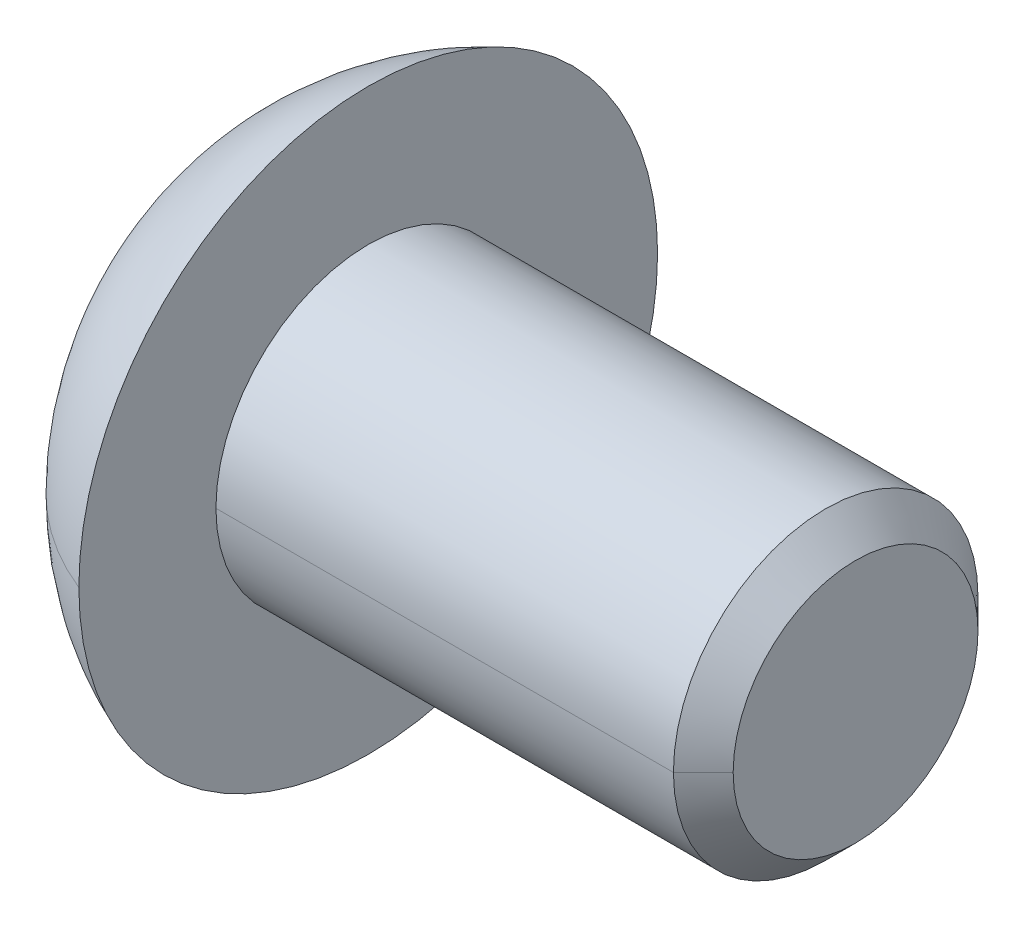
ISO-10303-21;
HEADER;
FILE_DESCRIPTION(('STEP AP214'),'2;1');
FILE_NAME('part.step','',(''),(''),'','','');
FILE_SCHEMA(('AUTOMOTIVE_DESIGN { 1 0 10303 214 1 1 1 1 }'));
ENDSEC;
DATA;
#1=APPLICATION_CONTEXT('core data for automotive mechanical design processes');
#2=APPLICATION_PROTOCOL_DEFINITION('international standard','automotive_design',2000,#1);
#3=PRODUCT_CONTEXT('',#1,'mechanical');
#4=PRODUCT('Part','Part','',(#3));
#5=PRODUCT_RELATED_PRODUCT_CATEGORY('part','',(#4));
#6=PRODUCT_DEFINITION_FORMATION('','',#4);
#7=PRODUCT_DEFINITION_CONTEXT('part definition',#1,'design');
#8=PRODUCT_DEFINITION('design','',#6,#7);
#9=PRODUCT_DEFINITION_SHAPE('','',#8);
#10=(LENGTH_UNIT() NAMED_UNIT(*) SI_UNIT(.MILLI.,.METRE.));
#11=(NAMED_UNIT(*) PLANE_ANGLE_UNIT() SI_UNIT($,.RADIAN.));
#12=(NAMED_UNIT(*) SI_UNIT($,.STERADIAN.) SOLID_ANGLE_UNIT());
#13=UNCERTAINTY_MEASURE_WITH_UNIT(LENGTH_MEASURE(1.E-05),#10,'distance_accuracy_value','');
#14=(GEOMETRIC_REPRESENTATION_CONTEXT(3) GLOBAL_UNCERTAINTY_ASSIGNED_CONTEXT((#13)) GLOBAL_UNIT_ASSIGNED_CONTEXT((#10,
#11,#12)) REPRESENTATION_CONTEXT('',''));
#15=CARTESIAN_POINT('',(0.,0.,0.));
#16=DIRECTION('',(0.,0.,1.));
#17=DIRECTION('',(1.,0.,0.));
#18=AXIS2_PLACEMENT_3D('',#15,#16,#17);
#19=CARTESIAN_POINT('',(-1.19,0.,0.));
#20=DIRECTION('',(1.,0.,0.));
#21=DIRECTION('',(0.,0.,-1.));
#22=AXIS2_PLACEMENT_3D('',#19,#20,#21);
#23=PLANE('',#22);
#24=DIRECTION('',(0.,-1.,0.));
#25=VECTOR('',#24,1.);
#26=CARTESIAN_POINT('',(-1.19,0.86602540378444,1.5));
#27=LINE('',#26,#25);
#28=CARTESIAN_POINT('',(-1.19,0.86602540378444,1.5));
#29=VERTEX_POINT('',#28);
#30=CARTESIAN_POINT('',(-1.19,0.,1.5));
#31=VERTEX_POINT('',#30);
#32=EDGE_CURVE('E11',#29,#31,#27,.T.);
#33=ORIENTED_EDGE('',*,*,#32,.F.);
#34=DIRECTION('',(0.,-0.500000000000009,0.866025403784433));
#35=VECTOR('',#34,1.);
#36=CARTESIAN_POINT('',(-1.19,1.7320508075689,0.));
#37=LINE('',#36,#35);
#38=CARTESIAN_POINT('',(-1.19,1.29903810567666,0.750000000000019));
#39=VERTEX_POINT('',#38);
#40=EDGE_CURVE('E25',#39,#29,#37,.T.);
#41=ORIENTED_EDGE('',*,*,#40,.F.);
#42=CARTESIAN_POINT('',(-1.19,0.,0.));
#43=DIRECTION('',(1.,0.,0.));
#44=DIRECTION('',(0.,0.,-1.));
#45=AXIS2_PLACEMENT_3D('',#42,#43,#44);
#46=CIRCLE('',#45,1.5);
#47=EDGE_CURVE('E392',#39,#31,#46,.T.);
#48=ORIENTED_EDGE('',*,*,#47,.T.);
#49=EDGE_LOOP('',(#33,#41,#48));
#50=FACE_BOUND('',#49,.T.);
#51=ADVANCED_FACE('F17',(#50),#23,.F.);
#52=CARTESIAN_POINT('',(-500.323974596216,0.,0.));
#53=DIRECTION('',(-1.,0.,0.));
#54=DIRECTION('',(0.,-1.,0.));
#55=AXIS2_PLACEMENT_3D('',#52,#53,#54);
#56=CONICAL_SURFACE('',#55,866.0254037844,1.0471975512);
#57=DIRECTION('',(-0.499999999997039,0.,0.866025403786148));
#58=VECTOR('',#57,1.);
#59=CARTESIAN_POINT('',(-0.323974600166881,0.,0.));
#60=LINE('',#59,#58);
#61=CARTESIAN_POINT('',(-0.32397459621556,0.,0.));
#62=VERTEX_POINT('',#61);
#63=EDGE_CURVE('E387',#62,#31,#60,.T.);
#64=ORIENTED_EDGE('',*,*,#63,.T.);
#65=ORIENTED_EDGE('',*,*,#47,.F.);
#66=CARTESIAN_POINT('',(-1.19,0.,0.));
#67=DIRECTION('',(1.,0.,0.));
#68=DIRECTION('',(0.,0.,-1.));
#69=AXIS2_PLACEMENT_3D('',#66,#67,#68);
#70=CIRCLE('',#69,1.5);
#71=CARTESIAN_POINT('',(-1.19,1.29903810567666,-0.750000000000019));
#72=VERTEX_POINT('',#71);
#73=EDGE_CURVE('E382',#72,#39,#70,.T.);
#74=ORIENTED_EDGE('',*,*,#73,.F.);
#75=CARTESIAN_POINT('',(-1.19,0.,0.));
#76=DIRECTION('',(1.,0.,0.));
#77=DIRECTION('',(0.,0.,-1.));
#78=AXIS2_PLACEMENT_3D('',#75,#76,#77);
#79=CIRCLE('',#78,1.5);
#80=CARTESIAN_POINT('',(-1.19,0.,-1.5));
#81=VERTEX_POINT('',#80);
#82=EDGE_CURVE('E377',#81,#72,#79,.T.);
#83=ORIENTED_EDGE('',*,*,#82,.F.);
#84=DIRECTION('',(-0.499999999997039,0.,-0.866025403786148));
#85=VECTOR('',#84,1.);
#86=CARTESIAN_POINT('',(-0.323974600166881,0.,0.));
#87=LINE('',#86,#85);
#88=EDGE_CURVE('E372',#62,#81,#87,.T.);
#89=ORIENTED_EDGE('',*,*,#88,.F.);
#90=EDGE_LOOP('',(#64,#65,#74,#83,#89));
#91=FACE_BOUND('',#90,.T.);
#92=ADVANCED_FACE('F408',(#91),#56,.F.);
#93=CARTESIAN_POINT('',(-500.323974596216,0.,0.));
#94=DIRECTION('',(-1.,0.,0.));
#95=DIRECTION('',(0.,1.,0.));
#96=AXIS2_PLACEMENT_3D('',#93,#94,#95);
#97=CONICAL_SURFACE('',#96,866.0254037844,1.0471975512);
#98=ORIENTED_EDGE('',*,*,#88,.T.);
#99=CARTESIAN_POINT('',(-1.19,0.,0.));
#100=DIRECTION('',(1.,0.,0.));
#101=DIRECTION('',(0.,0.,-1.));
#102=AXIS2_PLACEMENT_3D('',#99,#100,#101);
#103=CIRCLE('',#102,1.5);
#104=CARTESIAN_POINT('',(-1.19,-1.29903810567666,-0.750000000000019));
#105=VERTEX_POINT('',#104);
#106=EDGE_CURVE('E367',#105,#81,#103,.T.);
#107=ORIENTED_EDGE('',*,*,#106,.F.);
#108=CARTESIAN_POINT('',(-1.19,0.,0.));
#109=DIRECTION('',(1.,0.,0.));
#110=DIRECTION('',(0.,0.,-1.));
#111=AXIS2_PLACEMENT_3D('',#108,#109,#110);
#112=CIRCLE('',#111,1.5);
#113=CARTESIAN_POINT('',(-1.19,-1.29903810567666,0.750000000000019));
#114=VERTEX_POINT('',#113);
#115=EDGE_CURVE('E362',#114,#105,#112,.T.);
#116=ORIENTED_EDGE('',*,*,#115,.F.);
#117=CARTESIAN_POINT('',(-1.19,0.,0.));
#118=DIRECTION('',(1.,0.,0.));
#119=DIRECTION('',(0.,0.,-1.));
#120=AXIS2_PLACEMENT_3D('',#117,#118,#119);
#121=CIRCLE('',#120,1.5);
#122=EDGE_CURVE('E357',#31,#114,#121,.T.);
#123=ORIENTED_EDGE('',*,*,#122,.F.);
#124=ORIENTED_EDGE('',*,*,#63,.F.);
#125=EDGE_LOOP('',(#98,#107,#116,#123,#124));
#126=FACE_BOUND('',#125,.T.);
#127=ADVANCED_FACE('F423',(#126),#97,.F.);
#128=CARTESIAN_POINT('',(-1.19,0.,0.));
#129=DIRECTION('',(1.,0.,0.));
#130=DIRECTION('',(0.,0.,-1.));
#131=AXIS2_PLACEMENT_3D('',#128,#129,#130);
#132=PLANE('',#131);
#133=DIRECTION('',(0.,-0.500000000000009,-0.866025403784433));
#134=VECTOR('',#133,1.);
#135=CARTESIAN_POINT('',(-1.19,-0.86602540378444,1.5));
#136=LINE('',#135,#134);
#137=CARTESIAN_POINT('',(-1.19,-0.86602540378444,1.5));
#138=VERTEX_POINT('',#137);
#139=EDGE_CURVE('E352',#138,#114,#136,.T.);
#140=ORIENTED_EDGE('',*,*,#139,.F.);
#141=DIRECTION('',(0.,-1.,0.));
#142=VECTOR('',#141,1.);
#143=CARTESIAN_POINT('',(-1.19,0.86602540378444,1.5));
#144=LINE('',#143,#142);
#145=EDGE_CURVE('E347',#31,#138,#144,.T.);
#146=ORIENTED_EDGE('',*,*,#145,.F.);
#147=ORIENTED_EDGE('',*,*,#122,.T.);
#148=EDGE_LOOP('',(#140,#146,#147));
#149=FACE_BOUND('',#148,.T.);
#150=ADVANCED_FACE('F438',(#149),#132,.F.);
#151=CARTESIAN_POINT('',(-1.19,0.86602540378444,1.5));
#152=DIRECTION('',(0.,0.,-1.));
#153=DIRECTION('',(-1.,0.,0.));
#154=AXIS2_PLACEMENT_3D('',#151,#152,#153);
#155=PLANE('',#154);
#156=ORIENTED_EDGE('',*,*,#32,.T.);
#157=ORIENTED_EDGE('',*,*,#145,.T.);
#158=DIRECTION('',(-1.,0.,0.));
#159=VECTOR('',#158,1.);
#160=CARTESIAN_POINT('',(-1.19,-0.86602540378444,1.5));
#161=LINE('',#160,#159);
#162=CARTESIAN_POINT('',(-2.75,-0.86602540378444,1.5));
#163=VERTEX_POINT('',#162);
#164=EDGE_CURVE('E343',#138,#163,#161,.T.);
#165=ORIENTED_EDGE('',*,*,#164,.T.);
#166=DIRECTION('',(0.,1.,0.));
#167=VECTOR('',#166,1.);
#168=CARTESIAN_POINT('',(-2.75,1.5,1.5));
#169=LINE('',#168,#167);
#170=CARTESIAN_POINT('',(-2.75,0.86602540378444,1.5));
#171=VERTEX_POINT('',#170);
#172=EDGE_CURVE('E339',#163,#171,#169,.T.);
#173=ORIENTED_EDGE('',*,*,#172,.T.);
#174=DIRECTION('',(-1.,0.,0.));
#175=VECTOR('',#174,1.);
#176=CARTESIAN_POINT('',(-1.19,0.86602540378444,1.5));
#177=LINE('',#176,#175);
#178=EDGE_CURVE('E334',#29,#171,#177,.T.);
#179=ORIENTED_EDGE('',*,*,#178,.F.);
#180=EDGE_LOOP('',(#156,#157,#165,#173,#179));
#181=FACE_BOUND('',#180,.T.);
#182=ADVANCED_FACE('F440',(#181),#155,.T.);
#183=CARTESIAN_POINT('',(-1.19,1.7320508075689,0.));
#184=DIRECTION('',(0.,-0.866025403784433,-0.500000000000009));
#185=DIRECTION('',(0.,0.500000000000009,-0.866025403784433));
#186=AXIS2_PLACEMENT_3D('',#183,#184,#185);
#187=PLANE('',#186);
#188=DIRECTION('',(0.,-0.500000000000009,0.866025403784433));
#189=VECTOR('',#188,1.);
#190=CARTESIAN_POINT('',(-1.19,1.7320508075689,0.));
#191=LINE('',#190,#189);
#192=CARTESIAN_POINT('',(-1.19,1.7320508075689,0.));
#193=VERTEX_POINT('',#192);
#194=EDGE_CURVE('E329',#193,#39,#191,.T.);
#195=ORIENTED_EDGE('',*,*,#194,.T.);
#196=ORIENTED_EDGE('',*,*,#40,.T.);
#197=ORIENTED_EDGE('',*,*,#178,.T.);
#198=DIRECTION('',(0.,0.500000000000009,-0.866025403784433));
#199=VECTOR('',#198,1.);
#200=CARTESIAN_POINT('',(-2.75,1.67403810567667,0.100480947161682));
#201=LINE('',#200,#199);
#202=CARTESIAN_POINT('',(-2.75,1.7320508075689,0.));
#203=VERTEX_POINT('',#202);
#204=EDGE_CURVE('E325',#171,#203,#201,.T.);
#205=ORIENTED_EDGE('',*,*,#204,.T.);
#206=DIRECTION('',(-1.,0.,0.));
#207=VECTOR('',#206,1.);
#208=CARTESIAN_POINT('',(-1.19,1.7320508075689,0.));
#209=LINE('',#208,#207);
#210=EDGE_CURVE('E320',#193,#203,#209,.T.);
#211=ORIENTED_EDGE('',*,*,#210,.F.);
#212=EDGE_LOOP('',(#195,#196,#197,#205,#211));
#213=FACE_BOUND('',#212,.T.);
#214=ADVANCED_FACE('F401',(#213),#187,.T.);
#215=CARTESIAN_POINT('',(-1.19,0.86602540378444,-1.5));
#216=DIRECTION('',(0.,-0.866025403784433,0.500000000000009));
#217=DIRECTION('',(0.,-0.500000000000009,-0.866025403784433));
#218=AXIS2_PLACEMENT_3D('',#215,#216,#217);
#219=PLANE('',#218);
#220=DIRECTION('',(0.,0.500000000000009,0.866025403784433));
#221=VECTOR('',#220,1.);
#222=CARTESIAN_POINT('',(-1.19,0.86602540378444,-1.5));
#223=LINE('',#222,#221);
#224=CARTESIAN_POINT('',(-1.19,0.86602540378444,-1.5));
#225=VERTEX_POINT('',#224);
#226=EDGE_CURVE('E315',#225,#72,#223,.T.);
#227=ORIENTED_EDGE('',*,*,#226,.T.);
#228=DIRECTION('',(0.,0.500000000000009,0.866025403784433));
#229=VECTOR('',#228,1.);
#230=CARTESIAN_POINT('',(-1.19,0.86602540378444,-1.5));
#231=LINE('',#230,#229);
#232=EDGE_CURVE('E310',#72,#193,#231,.T.);
#233=ORIENTED_EDGE('',*,*,#232,.T.);
#234=ORIENTED_EDGE('',*,*,#210,.T.);
#235=DIRECTION('',(0.,-0.500000000000009,-0.866025403784433));
#236=VECTOR('',#235,1.);
#237=CARTESIAN_POINT('',(-2.75,1.67403810567667,-0.100480947161682));
#238=LINE('',#237,#236);
#239=CARTESIAN_POINT('',(-2.75,0.86602540378444,-1.5));
#240=VERTEX_POINT('',#239);
#241=EDGE_CURVE('E306',#203,#240,#238,.T.);
#242=ORIENTED_EDGE('',*,*,#241,.T.);
#243=DIRECTION('',(-1.,0.,0.));
#244=VECTOR('',#243,1.);
#245=CARTESIAN_POINT('',(-1.19,0.86602540378444,-1.5));
#246=LINE('',#245,#244);
#247=EDGE_CURVE('E301',#225,#240,#246,.T.);
#248=ORIENTED_EDGE('',*,*,#247,.F.);
#249=EDGE_LOOP('',(#227,#233,#234,#242,#248));
#250=FACE_BOUND('',#249,.T.);
#251=ADVANCED_FACE('F411',(#250),#219,.T.);
#252=CARTESIAN_POINT('',(-1.19,-0.86602540378444,-1.5));
#253=DIRECTION('',(0.,0.,1.));
#254=DIRECTION('',(1.,0.,0.));
#255=AXIS2_PLACEMENT_3D('',#252,#253,#254);
#256=PLANE('',#255);
#257=DIRECTION('',(0.,1.,0.));
#258=VECTOR('',#257,1.);
#259=CARTESIAN_POINT('',(-1.19,-0.86602540378444,-1.5));
#260=LINE('',#259,#258);
#261=CARTESIAN_POINT('',(-1.19,-0.86602540378444,-1.5));
#262=VERTEX_POINT('',#261);
#263=EDGE_CURVE('E296',#262,#81,#260,.T.);
#264=ORIENTED_EDGE('',*,*,#263,.T.);
#265=DIRECTION('',(0.,1.,0.));
#266=VECTOR('',#265,1.);
#267=CARTESIAN_POINT('',(-1.19,-0.86602540378444,-1.5));
#268=LINE('',#267,#266);
#269=EDGE_CURVE('E291',#81,#225,#268,.T.);
#270=ORIENTED_EDGE('',*,*,#269,.T.);
#271=ORIENTED_EDGE('',*,*,#247,.T.);
#272=DIRECTION('',(0.,-1.,0.));
#273=VECTOR('',#272,1.);
#274=CARTESIAN_POINT('',(-2.75,1.5,-1.5));
#275=LINE('',#274,#273);
#276=CARTESIAN_POINT('',(-2.75,-0.86602540378444,-1.5));
#277=VERTEX_POINT('',#276);
#278=EDGE_CURVE('E287',#240,#277,#275,.T.);
#279=ORIENTED_EDGE('',*,*,#278,.T.);
#280=DIRECTION('',(-1.,0.,0.));
#281=VECTOR('',#280,1.);
#282=CARTESIAN_POINT('',(-1.19,-0.86602540378444,-1.5));
#283=LINE('',#282,#281);
#284=EDGE_CURVE('E282',#262,#277,#283,.T.);
#285=ORIENTED_EDGE('',*,*,#284,.F.);
#286=EDGE_LOOP('',(#264,#270,#271,#279,#285));
#287=FACE_BOUND('',#286,.T.);
#288=ADVANCED_FACE('F416',(#287),#256,.T.);
#289=CARTESIAN_POINT('',(-1.19,-1.7320508075689,0.));
#290=DIRECTION('',(0.,0.866025403784433,0.500000000000009));
#291=DIRECTION('',(0.,-0.500000000000009,0.866025403784433));
#292=AXIS2_PLACEMENT_3D('',#289,#290,#291);
#293=PLANE('',#292);
#294=DIRECTION('',(0.,0.500000000000009,-0.866025403784433));
#295=VECTOR('',#294,1.);
#296=CARTESIAN_POINT('',(-1.19,-1.7320508075689,0.));
#297=LINE('',#296,#295);
#298=CARTESIAN_POINT('',(-1.19,-1.7320508075689,0.));
#299=VERTEX_POINT('',#298);
#300=EDGE_CURVE('E277',#299,#105,#297,.T.);
#301=ORIENTED_EDGE('',*,*,#300,.T.);
#302=DIRECTION('',(0.,0.500000000000009,-0.866025403784433));
#303=VECTOR('',#302,1.);
#304=CARTESIAN_POINT('',(-1.19,-1.7320508075689,0.));
#305=LINE('',#304,#303);
#306=EDGE_CURVE('E272',#105,#262,#305,.T.);
#307=ORIENTED_EDGE('',*,*,#306,.T.);
#308=ORIENTED_EDGE('',*,*,#284,.T.);
#309=DIRECTION('',(0.,-0.500000000000009,0.866025403784433));
#310=VECTOR('',#309,1.);
#311=CARTESIAN_POINT('',(-2.75,-0.924038105676645,-1.39951905283836));
#312=LINE('',#311,#310);
#313=CARTESIAN_POINT('',(-2.75,-1.7320508075689,0.));
#314=VERTEX_POINT('',#313);
#315=EDGE_CURVE('E268',#277,#314,#312,.T.);
#316=ORIENTED_EDGE('',*,*,#315,.T.);
#317=DIRECTION('',(-1.,0.,0.));
#318=VECTOR('',#317,1.);
#319=CARTESIAN_POINT('',(-1.19,-1.7320508075689,0.));
#320=LINE('',#319,#318);
#321=EDGE_CURVE('E263',#299,#314,#320,.T.);
#322=ORIENTED_EDGE('',*,*,#321,.F.);
#323=EDGE_LOOP('',(#301,#307,#308,#316,#322));
#324=FACE_BOUND('',#323,.T.);
#325=ADVANCED_FACE('F428',(#324),#293,.T.);
#326=CARTESIAN_POINT('',(-1.19,-0.86602540378444,1.5));
#327=DIRECTION('',(0.,0.866025403784433,-0.500000000000009));
#328=DIRECTION('',(0.,0.500000000000009,0.866025403784433));
#329=AXIS2_PLACEMENT_3D('',#326,#327,#328);
#330=PLANE('',#329);
#331=ORIENTED_EDGE('',*,*,#139,.T.);
#332=DIRECTION('',(0.,-0.500000000000009,-0.866025403784433));
#333=VECTOR('',#332,1.);
#334=CARTESIAN_POINT('',(-1.19,-0.86602540378444,1.5));
#335=LINE('',#334,#333);
#336=EDGE_CURVE('E258',#114,#299,#335,.T.);
#337=ORIENTED_EDGE('',*,*,#336,.T.);
#338=ORIENTED_EDGE('',*,*,#321,.T.);
#339=DIRECTION('',(0.,0.500000000000009,0.866025403784433));
#340=VECTOR('',#339,1.);
#341=CARTESIAN_POINT('',(-2.75,-0.924038105676645,1.39951905283836));
#342=LINE('',#341,#340);
#343=EDGE_CURVE('E253',#314,#163,#342,.T.);
#344=ORIENTED_EDGE('',*,*,#343,.T.);
#345=ORIENTED_EDGE('',*,*,#164,.F.);
#346=EDGE_LOOP('',(#331,#337,#338,#344,#345));
#347=FACE_BOUND('',#346,.T.);
#348=ADVANCED_FACE('F433',(#347),#330,.T.);
#349=CARTESIAN_POINT('',(-2.75,1.5,0.));
#350=DIRECTION('',(1.,0.,0.));
#351=DIRECTION('',(0.,0.,-1.));
#352=AXIS2_PLACEMENT_3D('',#349,#350,#351);
#353=PLANE('',#352);
#354=CARTESIAN_POINT('',(-2.75,0.,0.));
#355=DIRECTION('',(1.,0.,0.));
#356=DIRECTION('',(0.,0.,-1.));
#357=AXIS2_PLACEMENT_3D('',#354,#355,#356);
#358=CIRCLE('',#357,1.8);
#359=CARTESIAN_POINT('',(-2.75,0.,-1.8));
#360=VERTEX_POINT('',#359);
#361=CARTESIAN_POINT('',(-2.75,0.,1.8));
#362=VERTEX_POINT('',#361);
#363=EDGE_CURVE('E249',#360,#362,#358,.T.);
#364=ORIENTED_EDGE('',*,*,#363,.F.);
#365=CARTESIAN_POINT('',(-2.75,0.,0.));
#366=DIRECTION('',(1.,0.,0.));
#367=DIRECTION('',(0.,0.,-1.));
#368=AXIS2_PLACEMENT_3D('',#365,#366,#367);
#369=CIRCLE('',#368,1.8);
#370=EDGE_CURVE('E247',#362,#360,#369,.T.);
#371=ORIENTED_EDGE('',*,*,#370,.F.);
#372=EDGE_LOOP('',(#364,#371));
#373=FACE_BOUND('',#372,.T.);
#374=ORIENTED_EDGE('',*,*,#315,.F.);
#375=ORIENTED_EDGE('',*,*,#278,.F.);
#376=ORIENTED_EDGE('',*,*,#241,.F.);
#377=ORIENTED_EDGE('',*,*,#204,.F.);
#378=ORIENTED_EDGE('',*,*,#172,.F.);
#379=ORIENTED_EDGE('',*,*,#343,.F.);
#380=EDGE_LOOP('',(#374,#375,#376,#377,#378,#379));
#381=FACE_BOUND('',#380,.T.);
#382=ADVANCED_FACE('F444',(#373,#381),#353,.F.);
#383=CARTESIAN_POINT('',(0.,0.,4.75));
#384=CARTESIAN_POINT('',(0.,-9.5,4.75));
#385=CARTESIAN_POINT('',(0.,-9.5,-4.75));
#386=CARTESIAN_POINT('',(0.,0.,-4.75));
#387=CARTESIAN_POINT('',(-1.33136495449777,0.,4.21509314825926));
#388=CARTESIAN_POINT('',(-1.33136495449777,-8.43018629651852,4.21509314825926));
#389=CARTESIAN_POINT('',(-1.33136495449777,-8.43018629651852,-4.21509314825926));
#390=CARTESIAN_POINT('',(-1.33136495449777,0.,-4.21509314825926));
#391=CARTESIAN_POINT('',(-2.30972286373403,0.,3.16558193653309));
#392=CARTESIAN_POINT('',(-2.30972286373403,-6.33116387306619,3.1655819365331));
#393=CARTESIAN_POINT('',(-2.30972286373403,-6.33116387306619,-3.1655819365331));
#394=CARTESIAN_POINT('',(-2.30972286373403,0.,-3.16558193653309));
#395=CARTESIAN_POINT('',(-2.75,0.,1.8));
#396=CARTESIAN_POINT('',(-2.75,-3.59999999999999,1.8));
#397=CARTESIAN_POINT('',(-2.75,-3.59999999999999,-1.8));
#398=CARTESIAN_POINT('',(-2.75,0.,-1.8));
#399=(BOUNDED_SURFACE() B_SPLINE_SURFACE(3,3,((#383,#384,#385,#386),(#387,#388,#389,#390),(#391,
#392,#393,#394),(#395,#396,#397,#398)),.UNSPECIFIED.,.F.,.F.,
.F.) B_SPLINE_SURFACE_WITH_KNOTS((4,4),(4,4),(0.,7.41739745553081),(-35.5435450504011,
-16.5500534312026),
.UNSPECIFIED.) GEOMETRIC_REPRESENTATION_ITEM() RATIONAL_B_SPLINE_SURFACE(((1.,0.333333333333333,
0.333333333333333,1.),(0.936944095829158,0.312314698609719,0.312314698609719,0.936944095829158),
(0.936944095829158,0.312314698609719,0.312314698609719,0.936944095829158),(1.,0.333333333333333,
0.333333333333333,1.))) REPRESENTATION_ITEM('') SURFACE());
#400=CARTESIAN_POINT('',(0.,0.,-4.75));
#401=CARTESIAN_POINT('',(-1.33136495449777,0.,-4.21509314825926));
#402=CARTESIAN_POINT('',(-2.30972286373403,0.,-3.16558193653309));
#403=CARTESIAN_POINT('',(-2.75,0.,-1.8));
#404=(BOUNDED_CURVE() B_SPLINE_CURVE(3,(#400,#401,#402,#403),.UNSPECIFIED.,.F.,
.F.) B_SPLINE_CURVE_WITH_KNOTS((4,4),(0.,7.41739745553081),
.UNSPECIFIED.) CURVE() GEOMETRIC_REPRESENTATION_ITEM() RATIONAL_B_SPLINE_CURVE((1.,
0.936944095829158,0.936944095829158,1.)) REPRESENTATION_ITEM(''));
#405=CARTESIAN_POINT('',(0.,0.,-4.75));
#406=VERTEX_POINT('',#405);
#407=EDGE_CURVE('E215',#406,#360,#404,.T.);
#408=CARTESIAN_POINT('',(0.,0.,0.));
#409=DIRECTION('',(1.,0.,0.));
#410=DIRECTION('',(0.,0.,-1.));
#411=AXIS2_PLACEMENT_3D('',#408,#409,#410);
#412=CIRCLE('',#411,4.75);
#413=CARTESIAN_POINT('',(0.,0.,4.75));
#414=VERTEX_POINT('',#413);
#415=EDGE_CURVE('E233',#414,#406,#412,.T.);
#416=CARTESIAN_POINT('',(0.,0.,4.75));
#417=CARTESIAN_POINT('',(-1.33136495449777,0.,4.21509314825926));
#418=CARTESIAN_POINT('',(-2.30972286373403,0.,3.16558193653309));
#419=CARTESIAN_POINT('',(-2.75,0.,1.8));
#420=(BOUNDED_CURVE() B_SPLINE_CURVE(3,(#416,#417,#418,#419),.UNSPECIFIED.,.F.,
.F.) B_SPLINE_CURVE_WITH_KNOTS((4,4),(0.,7.41739745553081),
.UNSPECIFIED.) CURVE() GEOMETRIC_REPRESENTATION_ITEM() RATIONAL_B_SPLINE_CURVE((1.,
0.936944095829158,0.936944095829158,1.)) REPRESENTATION_ITEM(''));
#421=EDGE_CURVE('E218',#414,#362,#420,.T.);
#422=ORIENTED_EDGE('',*,*,#370,.T.);
#423=ORIENTED_EDGE('',*,*,#407,.F.);
#424=ORIENTED_EDGE('',*,*,#415,.F.);
#425=ORIENTED_EDGE('',*,*,#421,.T.);
#426=EDGE_LOOP('',(#422,#423,#424,#425));
#427=FACE_BOUND('',#426,.T.);
#428=ADVANCED_FACE('F190',(#427),#399,.T.);
#429=CARTESIAN_POINT('',(0.,0.,-4.75));
#430=CARTESIAN_POINT('',(0.,9.5,-4.75));
#431=CARTESIAN_POINT('',(0.,9.5,4.75));
#432=CARTESIAN_POINT('',(0.,0.,4.75));
#433=CARTESIAN_POINT('',(-1.33136495449777,0.,-4.21509314825926));
#434=CARTESIAN_POINT('',(-1.33136495449777,8.43018629651852,-4.21509314825926));
#435=CARTESIAN_POINT('',(-1.33136495449777,8.43018629651852,4.21509314825926));
#436=CARTESIAN_POINT('',(-1.33136495449777,0.,4.21509314825926));
#437=CARTESIAN_POINT('',(-2.30972286373403,0.,-3.16558193653309));
#438=CARTESIAN_POINT('',(-2.30972286373403,6.33116387306619,-3.1655819365331));
#439=CARTESIAN_POINT('',(-2.30972286373403,6.33116387306619,3.1655819365331));
#440=CARTESIAN_POINT('',(-2.30972286373403,0.,3.16558193653309));
#441=CARTESIAN_POINT('',(-2.75,0.,-1.8));
#442=CARTESIAN_POINT('',(-2.75,3.59999999999999,-1.8));
#443=CARTESIAN_POINT('',(-2.75,3.59999999999999,1.8));
#444=CARTESIAN_POINT('',(-2.75,0.,1.8));
#445=(BOUNDED_SURFACE() B_SPLINE_SURFACE(3,3,((#429,#430,#431,#432),(#433,#434,#435,#436),(#437,
#438,#439,#440),(#441,#442,#443,#444)),.UNSPECIFIED.,.F.,.F.,
.F.) B_SPLINE_SURFACE_WITH_KNOTS((4,4),(4,4),(0.,7.41739745553081),(-54.5370366695999,
-35.5435450504013),
.UNSPECIFIED.) GEOMETRIC_REPRESENTATION_ITEM() RATIONAL_B_SPLINE_SURFACE(((1.,0.333333333333333,
0.333333333333333,1.),(0.936944095829158,0.312314698609719,0.312314698609719,0.936944095829158),
(0.936944095829158,0.312314698609719,0.312314698609719,0.936944095829158),(1.,0.333333333333333,
0.333333333333333,1.))) REPRESENTATION_ITEM('') SURFACE());
#446=CARTESIAN_POINT('',(0.,0.,0.));
#447=DIRECTION('',(1.,0.,0.));
#448=DIRECTION('',(0.,0.,-1.));
#449=AXIS2_PLACEMENT_3D('',#446,#447,#448);
#450=CIRCLE('',#449,4.75);
#451=EDGE_CURVE('E168',#406,#414,#450,.T.);
#452=ORIENTED_EDGE('',*,*,#451,.F.);
#453=ORIENTED_EDGE('',*,*,#407,.T.);
#454=ORIENTED_EDGE('',*,*,#363,.T.);
#455=ORIENTED_EDGE('',*,*,#421,.F.);
#456=EDGE_LOOP('',(#452,#453,#454,#455));
#457=FACE_BOUND('',#456,.T.);
#458=ADVANCED_FACE('F177',(#457),#445,.T.);
#459=CARTESIAN_POINT('',(0.,4.75,0.));
#460=DIRECTION('',(-1.,0.,0.));
#461=DIRECTION('',(0.,0.,1.));
#462=AXIS2_PLACEMENT_3D('',#459,#460,#461);
#463=PLANE('',#462);
#464=CARTESIAN_POINT('',(0.,0.,0.));
#465=DIRECTION('',(1.,0.,0.));
#466=DIRECTION('',(0.,0.,-1.));
#467=AXIS2_PLACEMENT_3D('',#464,#465,#466);
#468=CIRCLE('',#467,2.5);
#469=CARTESIAN_POINT('',(0.,0.,-2.5));
#470=VERTEX_POINT('',#469);
#471=CARTESIAN_POINT('',(0.,0.,2.5));
#472=VERTEX_POINT('',#471);
#473=EDGE_CURVE('E163',#470,#472,#468,.T.);
#474=ORIENTED_EDGE('',*,*,#473,.F.);
#475=CARTESIAN_POINT('',(0.,0.,0.));
#476=DIRECTION('',(1.,0.,0.));
#477=DIRECTION('',(0.,0.,-1.));
#478=AXIS2_PLACEMENT_3D('',#475,#476,#477);
#479=CIRCLE('',#478,2.5);
#480=EDGE_CURVE('E158',#472,#470,#479,.T.);
#481=ORIENTED_EDGE('',*,*,#480,.F.);
#482=EDGE_LOOP('',(#474,#481));
#483=FACE_BOUND('',#482,.T.);
#484=ORIENTED_EDGE('',*,*,#451,.T.);
#485=ORIENTED_EDGE('',*,*,#415,.T.);
#486=EDGE_LOOP('',(#484,#485));
#487=FACE_BOUND('',#486,.T.);
#488=ADVANCED_FACE('F189',(#483,#487),#463,.F.);
#489=CARTESIAN_POINT('',(8.,0.,0.));
#490=DIRECTION('',(-1.,0.,0.));
#491=DIRECTION('',(0.,1.,0.));
#492=AXIS2_PLACEMENT_3D('',#489,#490,#491);
#493=CYLINDRICAL_SURFACE('',#492,2.5);
#494=ORIENTED_EDGE('',*,*,#480,.T.);
#495=DIRECTION('',(-1.,0.,0.));
#496=VECTOR('',#495,1.);
#497=CARTESIAN_POINT('',(7.5095,0.,-2.5));
#498=LINE('',#497,#496);
#499=CARTESIAN_POINT('',(7.5095,0.,-2.5));
#500=VERTEX_POINT('',#499);
#501=EDGE_CURVE('E153',#500,#470,#498,.T.);
#502=ORIENTED_EDGE('',*,*,#501,.F.);
#503=CARTESIAN_POINT('',(7.5095,0.,0.));
#504=DIRECTION('',(1.,0.,0.));
#505=DIRECTION('',(0.,0.,-1.));
#506=AXIS2_PLACEMENT_3D('',#503,#504,#505);
#507=CIRCLE('',#506,2.5);
#508=CARTESIAN_POINT('',(7.5095,0.,2.5));
#509=VERTEX_POINT('',#508);
#510=EDGE_CURVE('E149',#509,#500,#507,.T.);
#511=ORIENTED_EDGE('',*,*,#510,.F.);
#512=DIRECTION('',(-1.,0.,0.));
#513=VECTOR('',#512,1.);
#514=CARTESIAN_POINT('',(7.5095,0.,2.5));
#515=LINE('',#514,#513);
#516=EDGE_CURVE('E137',#509,#472,#515,.T.);
#517=ORIENTED_EDGE('',*,*,#516,.T.);
#518=EDGE_LOOP('',(#494,#502,#511,#517));
#519=FACE_BOUND('',#518,.T.);
#520=ADVANCED_FACE('F511',(#519),#493,.T.);
#521=CARTESIAN_POINT('',(8.,0.,0.));
#522=DIRECTION('',(-1.,0.,0.));
#523=DIRECTION('',(0.,-1.,0.));
#524=AXIS2_PLACEMENT_3D('',#521,#522,#523);
#525=CYLINDRICAL_SURFACE('',#524,2.5);
#526=CARTESIAN_POINT('',(7.5095,0.,0.));
#527=DIRECTION('',(1.,0.,0.));
#528=DIRECTION('',(0.,0.,-1.));
#529=AXIS2_PLACEMENT_3D('',#526,#527,#528);
#530=CIRCLE('',#529,2.5);
#531=EDGE_CURVE('E125',#500,#509,#530,.T.);
#532=ORIENTED_EDGE('',*,*,#531,.F.);
#533=ORIENTED_EDGE('',*,*,#501,.T.);
#534=ORIENTED_EDGE('',*,*,#473,.T.);
#535=ORIENTED_EDGE('',*,*,#516,.F.);
#536=EDGE_LOOP('',(#532,#533,#534,#535));
#537=FACE_BOUND('',#536,.T.);
#538=ADVANCED_FACE('F520',(#537),#525,.T.);
#539=CARTESIAN_POINT('',(7.5095,0.,0.));
#540=DIRECTION('',(-1.,0.,0.));
#541=DIRECTION('',(0.,-1.,0.));
#542=AXIS2_PLACEMENT_3D('',#539,#540,#541);
#543=CONICAL_SURFACE('',#542,2.5,0.7853981634);
#544=CARTESIAN_POINT('',(8.,0.,0.));
#545=DIRECTION('',(1.,0.,0.));
#546=DIRECTION('',(0.,0.,-1.));
#547=AXIS2_PLACEMENT_3D('',#544,#545,#546);
#548=CIRCLE('',#547,2.0095);
#549=CARTESIAN_POINT('',(8.,0.,-2.0095));
#550=VERTEX_POINT('',#549);
#551=CARTESIAN_POINT('',(7.99999999999875,0.,2.00949999999875));
#552=VERTEX_POINT('',#551);
#553=EDGE_CURVE('E122',#550,#552,#548,.T.);
#554=ORIENTED_EDGE('',*,*,#553,.F.);
#555=DIRECTION('',(-0.707106781184743,0.,-0.707106781188352));
#556=VECTOR('',#555,1.);
#557=CARTESIAN_POINT('',(7.99999999999875,0.,-2.00949999999875));
#558=LINE('',#557,#556);
#559=EDGE_CURVE('E128',#550,#500,#558,.T.);
#560=ORIENTED_EDGE('',*,*,#559,.T.);
#561=ORIENTED_EDGE('',*,*,#531,.T.);
#562=DIRECTION('',(-0.707106781184743,0.,0.707106781188352));
#563=VECTOR('',#562,1.);
#564=CARTESIAN_POINT('',(7.99999999999875,0.,2.00949999999875));
#565=LINE('',#564,#563);
#566=EDGE_CURVE('E117',#552,#509,#565,.T.);
#567=ORIENTED_EDGE('',*,*,#566,.F.);
#568=EDGE_LOOP('',(#554,#560,#561,#567));
#569=FACE_BOUND('',#568,.T.);
#570=ADVANCED_FACE('F119',(#569),#543,.T.);
#571=CARTESIAN_POINT('',(7.5095,0.,0.));
#572=DIRECTION('',(-1.,0.,0.));
#573=DIRECTION('',(0.,1.,0.));
#574=AXIS2_PLACEMENT_3D('',#571,#572,#573);
#575=CONICAL_SURFACE('',#574,2.5,0.7853981634);
#576=ORIENTED_EDGE('',*,*,#510,.T.);
#577=ORIENTED_EDGE('',*,*,#559,.F.);
#578=CARTESIAN_POINT('',(8.,0.,0.));
#579=DIRECTION('',(1.,0.,0.));
#580=DIRECTION('',(0.,0.,-1.));
#581=AXIS2_PLACEMENT_3D('',#578,#579,#580);
#582=CIRCLE('',#581,2.0095);
#583=EDGE_CURVE('E129',#552,#550,#582,.T.);
#584=ORIENTED_EDGE('',*,*,#583,.F.);
#585=ORIENTED_EDGE('',*,*,#566,.T.);
#586=EDGE_LOOP('',(#576,#577,#584,#585));
#587=FACE_BOUND('',#586,.T.);
#588=ADVANCED_FACE('F132',(#587),#575,.T.);
#589=CARTESIAN_POINT('',(8.,2.0095,0.));
#590=DIRECTION('',(-1.,0.,0.));
#591=DIRECTION('',(0.,0.,1.));
#592=AXIS2_PLACEMENT_3D('',#589,#590,#591);
#593=PLANE('',#592);
#594=ORIENTED_EDGE('',*,*,#553,.T.);
#595=ORIENTED_EDGE('',*,*,#583,.T.);
#596=EDGE_LOOP('',(#594,#595));
#597=FACE_BOUND('',#596,.T.);
#598=ADVANCED_FACE('F135',(#597),#593,.F.);
#599=CARTESIAN_POINT('',(-1.19,0.,0.));
#600=DIRECTION('',(1.,0.,0.));
#601=DIRECTION('',(0.,0.,-1.));
#602=AXIS2_PLACEMENT_3D('',#599,#600,#601);
#603=PLANE('',#602);
#604=ORIENTED_EDGE('',*,*,#300,.F.);
#605=ORIENTED_EDGE('',*,*,#336,.F.);
#606=ORIENTED_EDGE('',*,*,#115,.T.);
#607=EDGE_LOOP('',(#604,#605,#606));
#608=FACE_BOUND('',#607,.T.);
#609=ADVANCED_FACE('F431',(#608),#603,.F.);
#610=CARTESIAN_POINT('',(-1.19,0.,0.));
#611=DIRECTION('',(1.,0.,0.));
#612=DIRECTION('',(0.,0.,-1.));
#613=AXIS2_PLACEMENT_3D('',#610,#611,#612);
#614=PLANE('',#613);
#615=ORIENTED_EDGE('',*,*,#263,.F.);
#616=ORIENTED_EDGE('',*,*,#306,.F.);
#617=ORIENTED_EDGE('',*,*,#106,.T.);
#618=EDGE_LOOP('',(#615,#616,#617));
#619=FACE_BOUND('',#618,.T.);
#620=ADVANCED_FACE('F421',(#619),#614,.F.);
#621=CARTESIAN_POINT('',(-1.19,0.,0.));
#622=DIRECTION('',(1.,0.,0.));
#623=DIRECTION('',(0.,0.,-1.));
#624=AXIS2_PLACEMENT_3D('',#621,#622,#623);
#625=PLANE('',#624);
#626=ORIENTED_EDGE('',*,*,#226,.F.);
#627=ORIENTED_EDGE('',*,*,#269,.F.);
#628=ORIENTED_EDGE('',*,*,#82,.T.);
#629=EDGE_LOOP('',(#626,#627,#628));
#630=FACE_BOUND('',#629,.T.);
#631=ADVANCED_FACE('F414',(#630),#625,.F.);
#632=CARTESIAN_POINT('',(-1.19,0.,0.));
#633=DIRECTION('',(1.,0.,0.));
#634=DIRECTION('',(0.,0.,-1.));
#635=AXIS2_PLACEMENT_3D('',#632,#633,#634);
#636=PLANE('',#635);
#637=ORIENTED_EDGE('',*,*,#194,.F.);
#638=ORIENTED_EDGE('',*,*,#232,.F.);
#639=ORIENTED_EDGE('',*,*,#73,.T.);
#640=EDGE_LOOP('',(#637,#638,#639));
#641=FACE_BOUND('',#640,.T.);
#642=ADVANCED_FACE('F406',(#641),#636,.F.);
#643=CLOSED_SHELL('',(#51,#92,#127,#150,#182,#214,#251,#288,#325,#348,#382,#428,#458,#488,#520,
#538,#570,#588,#598,#609,#620,#631,#642));
#644=MANIFOLD_SOLID_BREP('B1',#643);
#645=ADVANCED_BREP_SHAPE_REPRESENTATION('',(#18,#644),#14);
#646=SHAPE_DEFINITION_REPRESENTATION(#9,#645);
ENDSEC;
END-ISO-10303-21;
